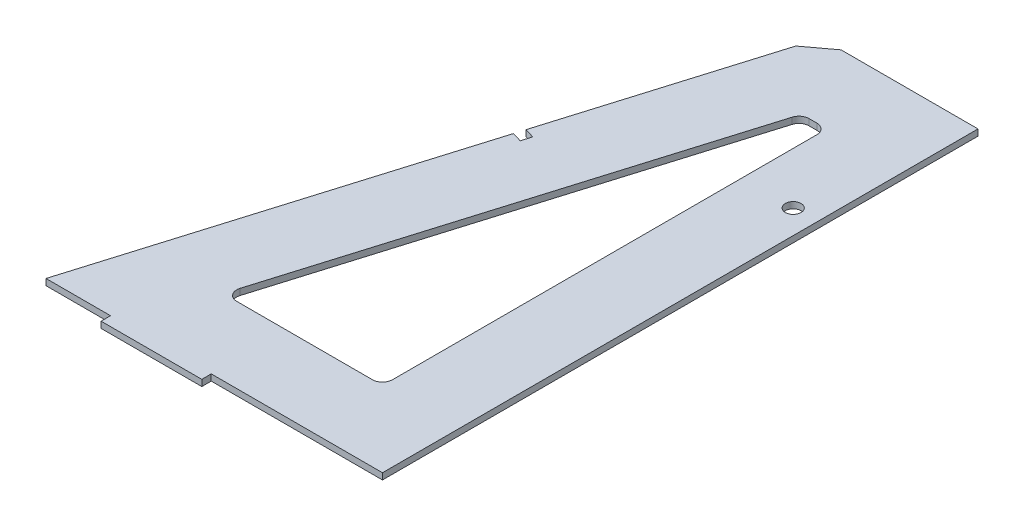
ISO-10303-21;
HEADER;
FILE_DESCRIPTION(('STEP AP214'),'2;1');
FILE_NAME('part.step','',(''),(''),'','','');
FILE_SCHEMA(('AUTOMOTIVE_DESIGN { 1 0 10303 214 1 1 1 1 }'));
ENDSEC;
DATA;
#1=APPLICATION_CONTEXT('core data for automotive mechanical design processes');
#2=APPLICATION_PROTOCOL_DEFINITION('international standard','automotive_design',2000,#1);
#3=PRODUCT_CONTEXT('',#1,'mechanical');
#4=PRODUCT('Part','Part','',(#3));
#5=PRODUCT_RELATED_PRODUCT_CATEGORY('part','',(#4));
#6=PRODUCT_DEFINITION_FORMATION('','',#4);
#7=PRODUCT_DEFINITION_CONTEXT('part definition',#1,'design');
#8=PRODUCT_DEFINITION('design','',#6,#7);
#9=PRODUCT_DEFINITION_SHAPE('','',#8);
#10=(LENGTH_UNIT() NAMED_UNIT(*) SI_UNIT(.MILLI.,.METRE.));
#11=(NAMED_UNIT(*) PLANE_ANGLE_UNIT() SI_UNIT($,.RADIAN.));
#12=(NAMED_UNIT(*) SI_UNIT($,.STERADIAN.) SOLID_ANGLE_UNIT());
#13=UNCERTAINTY_MEASURE_WITH_UNIT(LENGTH_MEASURE(1.E-05),#10,'distance_accuracy_value','');
#14=(GEOMETRIC_REPRESENTATION_CONTEXT(3) GLOBAL_UNCERTAINTY_ASSIGNED_CONTEXT((#13)) GLOBAL_UNIT_ASSIGNED_CONTEXT((#10,
#11,#12)) REPRESENTATION_CONTEXT('',''));
#15=CARTESIAN_POINT('',(0.,0.,0.));
#16=DIRECTION('',(0.,0.,1.));
#17=DIRECTION('',(1.,0.,0.));
#18=AXIS2_PLACEMENT_3D('',#15,#16,#17);
#19=CARTESIAN_POINT('',(-115.889171037202,3.175,0.));
#20=DIRECTION('',(0.95748987854251,0.,0.28846686549524));
#21=DIRECTION('',(0.28846686549524,0.,-0.95748987854251));
#22=AXIS2_PLACEMENT_3D('',#19,#20,#21);
#23=PLANE('',#22);
#24=DIRECTION('',(-0.28846686549524,0.,0.95748987854251));
#25=VECTOR('',#24,1.);
#26=CARTESIAN_POINT('',(-115.889171037202,0.,0.));
#27=LINE('',#26,#25);
#28=CARTESIAN_POINT('',(-28.3308233534316,0.,-290.626902834008));
#29=VERTEX_POINT('',#28);
#30=CARTESIAN_POINT('',(-59.8371744028218,0.,-186.049858299595));
#31=VERTEX_POINT('',#30);
#32=EDGE_CURVE('E214',#29,#31,#27,.T.);
#33=ORIENTED_EDGE('',*,*,#32,.T.);
#34=DIRECTION('',(0.,1.,0.));
#35=VECTOR('',#34,1.);
#36=CARTESIAN_POINT('',(-59.8371744028218,0.,-186.049858299595));
#37=LINE('',#36,#35);
#38=CARTESIAN_POINT('',(-59.8371744028218,3.175,-186.049858299595));
#39=VERTEX_POINT('',#38);
#40=EDGE_CURVE('E295',#31,#39,#37,.T.);
#41=ORIENTED_EDGE('',*,*,#40,.T.);
#42=DIRECTION('',(-0.28846686549524,0.,0.95748987854251));
#43=VECTOR('',#42,1.);
#44=CARTESIAN_POINT('',(-115.889171037202,3.175,0.));
#45=LINE('',#44,#43);
#46=CARTESIAN_POINT('',(-28.3308233534316,3.175,-290.626902834008));
#47=VERTEX_POINT('',#46);
#48=EDGE_CURVE('E402',#47,#39,#45,.T.);
#49=ORIENTED_EDGE('',*,*,#48,.F.);
#50=DIRECTION('',(0.,1.,0.));
#51=VECTOR('',#50,1.);
#52=CARTESIAN_POINT('',(-28.3308233534316,0.,-290.626902834008));
#53=LINE('',#52,#51);
#54=EDGE_CURVE('E341',#29,#47,#53,.T.);
#55=ORIENTED_EDGE('',*,*,#54,.F.);
#56=EDGE_LOOP('',(#33,#41,#49,#55));
#57=FACE_BOUND('',#56,.T.);
#58=ADVANCED_FACE('F41',(#57),#23,.F.);
#59=CARTESIAN_POINT('',(0.,3.175,0.));
#60=DIRECTION('',(0.,0.,-1.));
#61=DIRECTION('',(-1.,0.,0.));
#62=AXIS2_PLACEMENT_3D('',#59,#60,#61);
#63=PLANE('',#62);
#64=DIRECTION('',(0.,1.,0.));
#65=VECTOR('',#64,1.);
#66=CARTESIAN_POINT('',(-32.544585518601,3.175,0.));
#67=LINE('',#66,#65);
#68=CARTESIAN_POINT('',(-32.544585518601,0.,0.));
#69=VERTEX_POINT('',#68);
#70=CARTESIAN_POINT('',(-32.544585518601,3.175,0.));
#71=VERTEX_POINT('',#70);
#72=EDGE_CURVE('E364',#69,#71,#67,.T.);
#73=ORIENTED_EDGE('',*,*,#72,.F.);
#74=DIRECTION('',(1.,0.,0.));
#75=VECTOR('',#74,1.);
#76=CARTESIAN_POINT('',(0.,0.,0.));
#77=LINE('',#76,#75);
#78=CARTESIAN_POINT('',(53.8189678,0.,0.));
#79=VERTEX_POINT('',#78);
#80=EDGE_CURVE('E220',#69,#79,#77,.T.);
#81=ORIENTED_EDGE('',*,*,#80,.T.);
#82=DIRECTION('',(0.,-1.,0.));
#83=VECTOR('',#82,1.);
#84=CARTESIAN_POINT('',(53.8189678,3.175,0.));
#85=LINE('',#84,#83);
#86=CARTESIAN_POINT('',(53.8189678,3.175,0.));
#87=VERTEX_POINT('',#86);
#88=EDGE_CURVE('E331',#87,#79,#85,.T.);
#89=ORIENTED_EDGE('',*,*,#88,.F.);
#90=DIRECTION('',(1.,0.,0.));
#91=VECTOR('',#90,1.);
#92=CARTESIAN_POINT('',(0.,3.175,0.));
#93=LINE('',#92,#91);
#94=EDGE_CURVE('E405',#71,#87,#93,.T.);
#95=ORIENTED_EDGE('',*,*,#94,.F.);
#96=EDGE_LOOP('',(#73,#81,#89,#95));
#97=FACE_BOUND('',#96,.T.);
#98=ADVANCED_FACE('F419',(#97),#63,.F.);
#99=DIRECTION('',(0.,-1.,0.));
#100=VECTOR('',#99,1.);
#101=CARTESIAN_POINT('',(-83.344585518601,3.175,0.));
#102=LINE('',#101,#100);
#103=CARTESIAN_POINT('',(-83.3445855186009,3.175,0.));
#104=VERTEX_POINT('',#103);
#105=CARTESIAN_POINT('',(-83.344585518601,0.,0.));
#106=VERTEX_POINT('',#105);
#107=EDGE_CURVE('E370',#104,#106,#102,.T.);
#108=ORIENTED_EDGE('',*,*,#107,.F.);
#109=CARTESIAN_POINT('',(-115.889171037202,3.175,0.));
#110=VERTEX_POINT('',#109);
#111=EDGE_CURVE('E233',#110,#104,#93,.T.);
#112=ORIENTED_EDGE('',*,*,#111,.F.);
#113=DIRECTION('',(0.,-1.,0.));
#114=VECTOR('',#113,1.);
#115=CARTESIAN_POINT('',(-115.889171037202,3.175,0.));
#116=LINE('',#115,#114);
#117=CARTESIAN_POINT('',(-115.889171037202,0.,0.));
#118=VERTEX_POINT('',#117);
#119=EDGE_CURVE('E229',#110,#118,#116,.T.);
#120=ORIENTED_EDGE('',*,*,#119,.T.);
#121=EDGE_CURVE('E212',#118,#106,#77,.T.);
#122=ORIENTED_EDGE('',*,*,#121,.T.);
#123=EDGE_LOOP('',(#108,#112,#120,#122));
#124=FACE_BOUND('',#123,.T.);
#125=ADVANCED_FACE('F472',(#124),#63,.F.);
#126=CARTESIAN_POINT('',(-25.4,3.175,-300.355));
#127=DIRECTION('',(0.,0.,1.));
#128=DIRECTION('',(1.,0.,0.));
#129=AXIS2_PLACEMENT_3D('',#126,#127,#128);
#130=PLANE('',#129);
#131=DIRECTION('',(-1.,0.,0.));
#132=VECTOR('',#131,1.);
#133=CARTESIAN_POINT('',(-25.4,0.,-300.355));
#134=LINE('',#133,#132);
#135=CARTESIAN_POINT('',(53.8189678,0.,-300.355));
#136=VERTEX_POINT('',#135);
#137=CARTESIAN_POINT('',(-15.2399999999999,0.,-300.355));
#138=VERTEX_POINT('',#137);
#139=EDGE_CURVE('E215',#136,#138,#134,.T.);
#140=ORIENTED_EDGE('',*,*,#139,.T.);
#141=DIRECTION('',(0.,1.,0.));
#142=VECTOR('',#141,1.);
#143=CARTESIAN_POINT('',(-15.24,0.,-300.355));
#144=LINE('',#143,#142);
#145=CARTESIAN_POINT('',(-15.24,3.175,-300.355));
#146=VERTEX_POINT('',#145);
#147=EDGE_CURVE('E336',#138,#146,#144,.T.);
#148=ORIENTED_EDGE('',*,*,#147,.T.);
#149=DIRECTION('',(-1.,0.,0.));
#150=VECTOR('',#149,1.);
#151=CARTESIAN_POINT('',(-25.4,3.175,-300.355));
#152=LINE('',#151,#150);
#153=CARTESIAN_POINT('',(53.8189678,3.175,-300.355));
#154=VERTEX_POINT('',#153);
#155=EDGE_CURVE('E228',#154,#146,#152,.T.);
#156=ORIENTED_EDGE('',*,*,#155,.F.);
#157=DIRECTION('',(0.,1.,0.));
#158=VECTOR('',#157,1.);
#159=CARTESIAN_POINT('',(53.8189678,0.,-300.355));
#160=LINE('',#159,#158);
#161=EDGE_CURVE('E356',#136,#154,#160,.T.);
#162=ORIENTED_EDGE('',*,*,#161,.F.);
#163=EDGE_LOOP('',(#140,#148,#156,#162));
#164=FACE_BOUND('',#163,.T.);
#165=ADVANCED_FACE('F425',(#164),#130,.F.);
#166=CARTESIAN_POINT('',(-61.3025860795376,3.175,-181.185809716599));
#167=VERTEX_POINT('',#166);
#168=EDGE_CURVE('E203',#167,#110,#45,.T.);
#169=ORIENTED_EDGE('',*,*,#168,.F.);
#170=DIRECTION('',(0.,1.,0.));
#171=VECTOR('',#170,1.);
#172=CARTESIAN_POINT('',(-61.3025860795376,0.,-181.185809716599));
#173=LINE('',#172,#171);
#174=CARTESIAN_POINT('',(-61.3025860795376,0.,-181.185809716599));
#175=VERTEX_POINT('',#174);
#176=EDGE_CURVE('E189',#175,#167,#173,.T.);
#177=ORIENTED_EDGE('',*,*,#176,.F.);
#178=EDGE_CURVE('E201',#175,#118,#27,.T.);
#179=ORIENTED_EDGE('',*,*,#178,.T.);
#180=ORIENTED_EDGE('',*,*,#119,.F.);
#181=EDGE_LOOP('',(#169,#177,#179,#180));
#182=FACE_BOUND('',#181,.T.);
#183=ADVANCED_FACE('F199',(#182),#23,.F.);
#184=CARTESIAN_POINT('',(0.,3.175,0.));
#185=DIRECTION('',(0.,-1.,0.));
#186=DIRECTION('',(0.,0.,-1.));
#187=AXIS2_PLACEMENT_3D('',#184,#185,#186);
#188=PLANE('',#187);
#189=DIRECTION('',(1.,0.,0.));
#190=VECTOR('',#189,1.);
#191=CARTESIAN_POINT('',(-64.6190859162038,3.175,-38.1));
#192=LINE('',#191,#190);
#193=CARTESIAN_POINT('',(-57.7830745667374,3.175,-38.1));
#194=VERTEX_POINT('',#193);
#195=CARTESIAN_POINT('',(10.6389678,3.175,-38.1));
#196=VERTEX_POINT('',#195);
#197=EDGE_CURVE('E285',#194,#196,#192,.T.);
#198=ORIENTED_EDGE('',*,*,#197,.F.);
#199=CARTESIAN_POINT('',(-57.7830745667374,3.175,-43.18));
#200=DIRECTION('',(0.,-1.,0.));
#201=DIRECTION('',(0.,0.,-1.));
#202=AXIS2_PLACEMENT_3D('',#199,#200,#201);
#203=CIRCLE('',#202,5.08);
#204=CARTESIAN_POINT('',(-62.6471231497334,3.175,-44.6454116767158));
#205=VERTEX_POINT('',#204);
#206=EDGE_CURVE('E50',#194,#205,#203,.T.);
#207=ORIENTED_EDGE('',*,*,#206,.T.);
#208=DIRECTION('',(-0.28846686549524,0.,0.95748987854251));
#209=VECTOR('',#208,1.);
#210=CARTESIAN_POINT('',(2.91300155976297,3.175,-262.255));
#211=LINE('',#210,#209);
#212=CARTESIAN_POINT('',(1.82401985140209,3.175,-258.640411676716));
#213=VERTEX_POINT('',#212);
#214=EDGE_CURVE('E284',#213,#205,#211,.T.);
#215=ORIENTED_EDGE('',*,*,#214,.F.);
#216=CARTESIAN_POINT('',(6.68806843439804,3.175,-257.175));
#217=DIRECTION('',(0.,-1.,0.));
#218=DIRECTION('',(0.,0.,-1.));
#219=AXIS2_PLACEMENT_3D('',#216,#217,#218);
#220=CIRCLE('',#219,5.08);
#221=CARTESIAN_POINT('',(6.68806843439804,3.175,-262.255));
#222=VERTEX_POINT('',#221);
#223=EDGE_CURVE('E260',#213,#222,#220,.T.);
#224=ORIENTED_EDGE('',*,*,#223,.T.);
#225=DIRECTION('',(-1.,0.,0.));
#226=VECTOR('',#225,1.);
#227=CARTESIAN_POINT('',(15.7189678,3.175,-262.255));
#228=LINE('',#227,#226);
#229=CARTESIAN_POINT('',(10.6389678,3.175,-262.255));
#230=VERTEX_POINT('',#229);
#231=EDGE_CURVE('E312',#230,#222,#228,.T.);
#232=ORIENTED_EDGE('',*,*,#231,.F.);
#233=CARTESIAN_POINT('',(10.6389678,3.175,-257.175));
#234=DIRECTION('',(0.,-1.,0.));
#235=DIRECTION('',(0.,0.,-1.));
#236=AXIS2_PLACEMENT_3D('',#233,#234,#235);
#237=CIRCLE('',#236,5.08);
#238=CARTESIAN_POINT('',(15.7189678,3.175,-257.175));
#239=VERTEX_POINT('',#238);
#240=EDGE_CURVE('E266',#230,#239,#237,.T.);
#241=ORIENTED_EDGE('',*,*,#240,.T.);
#242=DIRECTION('',(0.,0.,-1.));
#243=VECTOR('',#242,1.);
#244=CARTESIAN_POINT('',(15.7189678,3.175,-38.1));
#245=LINE('',#244,#243);
#246=CARTESIAN_POINT('',(15.7189678,3.175,-43.18));
#247=VERTEX_POINT('',#246);
#248=EDGE_CURVE('E320',#247,#239,#245,.T.);
#249=ORIENTED_EDGE('',*,*,#248,.F.);
#250=CARTESIAN_POINT('',(10.6389678,3.175,-43.18));
#251=DIRECTION('',(0.,-1.,0.));
#252=DIRECTION('',(0.,0.,-1.));
#253=AXIS2_PLACEMENT_3D('',#250,#251,#252);
#254=CIRCLE('',#253,5.08);
#255=EDGE_CURVE('E272',#247,#196,#254,.T.);
#256=ORIENTED_EDGE('',*,*,#255,.T.);
#257=EDGE_LOOP('',(#198,#207,#215,#224,#232,#241,#249,#256));
#258=FACE_BOUND('',#257,.T.);
#259=CARTESIAN_POINT('',(41.7539678,3.175,-219.202));
#260=DIRECTION('',(0.,1.,0.));
#261=DIRECTION('',(0.,0.,1.));
#262=AXIS2_PLACEMENT_3D('',#259,#260,#261);
#263=CIRCLE('',#262,3.96874999999999);
#264=CARTESIAN_POINT('',(41.7539678,3.175,-215.23325));
#265=VERTEX_POINT('',#264);
#266=EDGE_CURVE('E332',#265,#265,#263,.T.);
#267=ORIENTED_EDGE('',*,*,#266,.F.);
#268=EDGE_LOOP('',(#267));
#269=FACE_BOUND('',#268,.T.);
#270=ORIENTED_EDGE('',*,*,#48,.T.);
#271=DIRECTION('',(-0.957489878542508,0.,-0.288466865495246));
#272=VECTOR('',#271,1.);
#273=CARTESIAN_POINT('',(-59.8371744028218,3.175,-186.049858299595));
#274=LINE('',#273,#272);
#275=CARTESIAN_POINT('',(-54.9731258198258,3.175,-184.584446622879));
#276=VERTEX_POINT('',#275);
#277=EDGE_CURVE('E195',#276,#39,#274,.T.);
#278=ORIENTED_EDGE('',*,*,#277,.F.);
#279=DIRECTION('',(0.288466865495241,0.,-0.95748987854251));
#280=VECTOR('',#279,1.);
#281=CARTESIAN_POINT('',(-54.9731258198258,3.175,-184.584446622879));
#282=LINE('',#281,#280);
#283=CARTESIAN_POINT('',(-56.4385374965417,3.175,-179.720398039883));
#284=VERTEX_POINT('',#283);
#285=EDGE_CURVE('E448',#284,#276,#282,.T.);
#286=ORIENTED_EDGE('',*,*,#285,.F.);
#287=DIRECTION('',(0.957489878542512,0.,0.288466865495235));
#288=VECTOR('',#287,1.);
#289=CARTESIAN_POINT('',(-56.4385374965417,3.175,-179.720398039883));
#290=LINE('',#289,#288);
#291=EDGE_CURVE('E449',#167,#284,#290,.T.);
#292=ORIENTED_EDGE('',*,*,#291,.F.);
#293=ORIENTED_EDGE('',*,*,#168,.T.);
#294=ORIENTED_EDGE('',*,*,#111,.T.);
#295=DIRECTION('',(0.,0.,-1.));
#296=VECTOR('',#295,1.);
#297=CARTESIAN_POINT('',(-83.344585518601,3.175,4.7625));
#298=LINE('',#297,#296);
#299=CARTESIAN_POINT('',(-83.344585518601,3.175,4.7625));
#300=VERTEX_POINT('',#299);
#301=EDGE_CURVE('E392',#300,#104,#298,.T.);
#302=ORIENTED_EDGE('',*,*,#301,.F.);
#303=DIRECTION('',(-1.,0.,0.));
#304=VECTOR('',#303,1.);
#305=CARTESIAN_POINT('',(-83.344585518601,3.175,4.7625));
#306=LINE('',#305,#304);
#307=CARTESIAN_POINT('',(-32.544585518601,3.175,4.7625));
#308=VERTEX_POINT('',#307);
#309=EDGE_CURVE('E369',#308,#300,#306,.T.);
#310=ORIENTED_EDGE('',*,*,#309,.F.);
#311=DIRECTION('',(0.,0.,-1.));
#312=VECTOR('',#311,1.);
#313=CARTESIAN_POINT('',(-32.544585518601,3.175,4.7625));
#314=LINE('',#313,#312);
#315=EDGE_CURVE('E222',#308,#71,#314,.T.);
#316=ORIENTED_EDGE('',*,*,#315,.T.);
#317=ORIENTED_EDGE('',*,*,#94,.T.);
#318=DIRECTION('',(0.,0.,1.));
#319=VECTOR('',#318,1.);
#320=CARTESIAN_POINT('',(53.8189678,3.175,-300.355));
#321=LINE('',#320,#319);
#322=EDGE_CURVE('E360',#154,#87,#321,.T.);
#323=ORIENTED_EDGE('',*,*,#322,.F.);
#324=ORIENTED_EDGE('',*,*,#155,.T.);
#325=DIRECTION('',(0.802641534402264,0.,-0.596461706442567));
#326=VECTOR('',#325,1.);
#327=CARTESIAN_POINT('',(-28.3308233534316,3.175,-290.626902834008));
#328=LINE('',#327,#326);
#329=EDGE_CURVE('E316',#47,#146,#328,.T.);
#330=ORIENTED_EDGE('',*,*,#329,.F.);
#331=EDGE_LOOP('',(#270,#278,#286,#292,#293,#294,#302,#310,#316,#317,#323,#324,#330));
#332=FACE_BOUND('',#331,.T.);
#333=ADVANCED_FACE('F282',(#258,#269,#332),#188,.F.);
#334=CARTESIAN_POINT('',(0.,0.,0.));
#335=DIRECTION('',(0.,-1.,0.));
#336=DIRECTION('',(0.,0.,-1.));
#337=AXIS2_PLACEMENT_3D('',#334,#335,#336);
#338=PLANE('',#337);
#339=DIRECTION('',(-0.957489878542508,0.,-0.288466865495246));
#340=VECTOR('',#339,1.);
#341=CARTESIAN_POINT('',(-59.8371744028218,0.,-186.049858299595));
#342=LINE('',#341,#340);
#343=CARTESIAN_POINT('',(-54.9731258198258,0.,-184.584446622879));
#344=VERTEX_POINT('',#343);
#345=EDGE_CURVE('E205',#344,#31,#342,.T.);
#346=ORIENTED_EDGE('',*,*,#345,.T.);
#347=ORIENTED_EDGE('',*,*,#32,.F.);
#348=DIRECTION('',(0.802641534402264,0.,-0.596461706442567));
#349=VECTOR('',#348,1.);
#350=CARTESIAN_POINT('',(-28.3308233534316,0.,-290.626902834008));
#351=LINE('',#350,#349);
#352=EDGE_CURVE('E337',#29,#138,#351,.T.);
#353=ORIENTED_EDGE('',*,*,#352,.T.);
#354=ORIENTED_EDGE('',*,*,#139,.F.);
#355=DIRECTION('',(0.,0.,-1.));
#356=VECTOR('',#355,1.);
#357=CARTESIAN_POINT('',(53.8189678,0.,0.));
#358=LINE('',#357,#356);
#359=EDGE_CURVE('E352',#79,#136,#358,.T.);
#360=ORIENTED_EDGE('',*,*,#359,.F.);
#361=ORIENTED_EDGE('',*,*,#80,.F.);
#362=DIRECTION('',(0.,0.,-1.));
#363=VECTOR('',#362,1.);
#364=CARTESIAN_POINT('',(-32.544585518601,0.,4.7625));
#365=LINE('',#364,#363);
#366=CARTESIAN_POINT('',(-32.544585518601,0.,4.7625));
#367=VERTEX_POINT('',#366);
#368=EDGE_CURVE('E379',#367,#69,#365,.T.);
#369=ORIENTED_EDGE('',*,*,#368,.F.);
#370=DIRECTION('',(1.,0.,0.));
#371=VECTOR('',#370,1.);
#372=CARTESIAN_POINT('',(-83.344585518601,0.,4.7625));
#373=LINE('',#372,#371);
#374=CARTESIAN_POINT('',(-83.344585518601,0.,4.7625));
#375=VERTEX_POINT('',#374);
#376=EDGE_CURVE('E376',#375,#367,#373,.T.);
#377=ORIENTED_EDGE('',*,*,#376,.F.);
#378=DIRECTION('',(0.,0.,-1.));
#379=VECTOR('',#378,1.);
#380=CARTESIAN_POINT('',(-83.344585518601,0.,4.7625));
#381=LINE('',#380,#379);
#382=EDGE_CURVE('E389',#375,#106,#381,.T.);
#383=ORIENTED_EDGE('',*,*,#382,.T.);
#384=ORIENTED_EDGE('',*,*,#121,.F.);
#385=ORIENTED_EDGE('',*,*,#178,.F.);
#386=DIRECTION('',(0.957489878542512,0.,0.288466865495235));
#387=VECTOR('',#386,1.);
#388=CARTESIAN_POINT('',(-56.4385374965417,0.,-179.720398039883));
#389=LINE('',#388,#387);
#390=CARTESIAN_POINT('',(-56.4385374965417,0.,-179.720398039883));
#391=VERTEX_POINT('',#390);
#392=EDGE_CURVE('E185',#175,#391,#389,.T.);
#393=ORIENTED_EDGE('',*,*,#392,.T.);
#394=DIRECTION('',(0.288466865495241,0.,-0.95748987854251));
#395=VECTOR('',#394,1.);
#396=CARTESIAN_POINT('',(-54.9731258198258,0.,-184.584446622879));
#397=LINE('',#396,#395);
#398=EDGE_CURVE('E57',#391,#344,#397,.T.);
#399=ORIENTED_EDGE('',*,*,#398,.T.);
#400=EDGE_LOOP('',(#346,#347,#353,#354,#360,#361,#369,#377,#383,#384,#385,#393,#399));
#401=FACE_BOUND('',#400,.T.);
#402=DIRECTION('',(-1.,0.,0.));
#403=VECTOR('',#402,1.);
#404=CARTESIAN_POINT('',(15.7189678,0.,-262.255));
#405=LINE('',#404,#403);
#406=CARTESIAN_POINT('',(10.6389678,0.,-262.255));
#407=VERTEX_POINT('',#406);
#408=CARTESIAN_POINT('',(6.68806843439804,0.,-262.255));
#409=VERTEX_POINT('',#408);
#410=EDGE_CURVE('E310',#407,#409,#405,.T.);
#411=ORIENTED_EDGE('',*,*,#410,.T.);
#412=CARTESIAN_POINT('',(6.68806843439804,0.,-257.175));
#413=DIRECTION('',(0.,-1.,0.));
#414=DIRECTION('',(0.,0.,-1.));
#415=AXIS2_PLACEMENT_3D('',#412,#413,#414);
#416=CIRCLE('',#415,5.08);
#417=CARTESIAN_POINT('',(1.82401985140209,0.,-258.640411676716));
#418=VERTEX_POINT('',#417);
#419=EDGE_CURVE('E263',#409,#418,#416,.F.);
#420=ORIENTED_EDGE('',*,*,#419,.T.);
#421=DIRECTION('',(-0.28846686549524,0.,0.95748987854251));
#422=VECTOR('',#421,1.);
#423=CARTESIAN_POINT('',(2.91300155976297,0.,-262.255));
#424=LINE('',#423,#422);
#425=CARTESIAN_POINT('',(-62.6471231497334,0.,-44.6454116767158));
#426=VERTEX_POINT('',#425);
#427=EDGE_CURVE('E302',#418,#426,#424,.T.);
#428=ORIENTED_EDGE('',*,*,#427,.T.);
#429=CARTESIAN_POINT('',(-57.7830745667374,0.,-43.18));
#430=DIRECTION('',(0.,-1.,0.));
#431=DIRECTION('',(0.,0.,-1.));
#432=AXIS2_PLACEMENT_3D('',#429,#430,#431);
#433=CIRCLE('',#432,5.08);
#434=CARTESIAN_POINT('',(-57.7830745667374,0.,-38.1));
#435=VERTEX_POINT('',#434);
#436=EDGE_CURVE('E11',#426,#435,#433,.F.);
#437=ORIENTED_EDGE('',*,*,#436,.T.);
#438=DIRECTION('',(1.,0.,0.));
#439=VECTOR('',#438,1.);
#440=CARTESIAN_POINT('',(-64.6190859162038,0.,-38.1));
#441=LINE('',#440,#439);
#442=CARTESIAN_POINT('',(10.6389678,0.,-38.1));
#443=VERTEX_POINT('',#442);
#444=EDGE_CURVE('E300',#435,#443,#441,.T.);
#445=ORIENTED_EDGE('',*,*,#444,.T.);
#446=CARTESIAN_POINT('',(10.6389678,0.,-43.18));
#447=DIRECTION('',(0.,-1.,0.));
#448=DIRECTION('',(0.,0.,-1.));
#449=AXIS2_PLACEMENT_3D('',#446,#447,#448);
#450=CIRCLE('',#449,5.08);
#451=CARTESIAN_POINT('',(15.7189678,0.,-43.18));
#452=VERTEX_POINT('',#451);
#453=EDGE_CURVE('E275',#443,#452,#450,.F.);
#454=ORIENTED_EDGE('',*,*,#453,.T.);
#455=DIRECTION('',(0.,0.,-1.));
#456=VECTOR('',#455,1.);
#457=CARTESIAN_POINT('',(15.7189678,0.,-38.1));
#458=LINE('',#457,#456);
#459=CARTESIAN_POINT('',(15.7189678,0.,-257.175));
#460=VERTEX_POINT('',#459);
#461=EDGE_CURVE('E305',#452,#460,#458,.T.);
#462=ORIENTED_EDGE('',*,*,#461,.T.);
#463=CARTESIAN_POINT('',(10.6389678,0.,-257.175));
#464=DIRECTION('',(0.,-1.,0.));
#465=DIRECTION('',(0.,0.,-1.));
#466=AXIS2_PLACEMENT_3D('',#463,#464,#465);
#467=CIRCLE('',#466,5.08);
#468=EDGE_CURVE('E269',#460,#407,#467,.F.);
#469=ORIENTED_EDGE('',*,*,#468,.T.);
#470=EDGE_LOOP('',(#411,#420,#428,#437,#445,#454,#462,#469));
#471=FACE_BOUND('',#470,.T.);
#472=CARTESIAN_POINT('',(41.7539678,0.,-219.202));
#473=DIRECTION('',(0.,1.,0.));
#474=DIRECTION('',(0.,0.,1.));
#475=AXIS2_PLACEMENT_3D('',#472,#473,#474);
#476=CIRCLE('',#475,3.96874999999999);
#477=CARTESIAN_POINT('',(41.7539678,0.,-215.23325));
#478=VERTEX_POINT('',#477);
#479=EDGE_CURVE('E327',#478,#478,#476,.T.);
#480=ORIENTED_EDGE('',*,*,#479,.T.);
#481=EDGE_LOOP('',(#480));
#482=FACE_BOUND('',#481,.T.);
#483=ADVANCED_FACE('F209',(#401,#471,#482),#338,.T.);
#484=CARTESIAN_POINT('',(-32.544585518601,3.175,4.7625));
#485=DIRECTION('',(-1.,0.,0.));
#486=DIRECTION('',(0.,-1.,0.));
#487=AXIS2_PLACEMENT_3D('',#484,#485,#486);
#488=PLANE('',#487);
#489=ORIENTED_EDGE('',*,*,#72,.T.);
#490=ORIENTED_EDGE('',*,*,#315,.F.);
#491=DIRECTION('',(0.,1.,0.));
#492=VECTOR('',#491,1.);
#493=CARTESIAN_POINT('',(-32.544585518601,3.175,4.7625));
#494=LINE('',#493,#492);
#495=EDGE_CURVE('E365',#367,#308,#494,.T.);
#496=ORIENTED_EDGE('',*,*,#495,.F.);
#497=ORIENTED_EDGE('',*,*,#368,.T.);
#498=EDGE_LOOP('',(#489,#490,#496,#497));
#499=FACE_BOUND('',#498,.T.);
#500=ADVANCED_FACE('F539',(#499),#488,.F.);
#501=CARTESIAN_POINT('',(-83.344585518601,3.175,4.7625));
#502=DIRECTION('',(1.,0.,0.));
#503=DIRECTION('',(0.,0.,-1.));
#504=AXIS2_PLACEMENT_3D('',#501,#502,#503);
#505=PLANE('',#504);
#506=ORIENTED_EDGE('',*,*,#107,.T.);
#507=ORIENTED_EDGE('',*,*,#382,.F.);
#508=DIRECTION('',(0.,-1.,0.));
#509=VECTOR('',#508,1.);
#510=CARTESIAN_POINT('',(-83.344585518601,3.175,4.7625));
#511=LINE('',#510,#509);
#512=EDGE_CURVE('E373',#300,#375,#511,.T.);
#513=ORIENTED_EDGE('',*,*,#512,.F.);
#514=ORIENTED_EDGE('',*,*,#301,.T.);
#515=EDGE_LOOP('',(#506,#507,#513,#514));
#516=FACE_BOUND('',#515,.T.);
#517=ADVANCED_FACE('F535',(#516),#505,.F.);
#518=CARTESIAN_POINT('',(0.,0.,4.7625));
#519=DIRECTION('',(0.,0.,1.));
#520=DIRECTION('',(1.,0.,0.));
#521=AXIS2_PLACEMENT_3D('',#518,#519,#520);
#522=PLANE('',#521);
#523=ORIENTED_EDGE('',*,*,#495,.T.);
#524=ORIENTED_EDGE('',*,*,#309,.T.);
#525=ORIENTED_EDGE('',*,*,#512,.T.);
#526=ORIENTED_EDGE('',*,*,#376,.T.);
#527=EDGE_LOOP('',(#523,#524,#525,#526));
#528=FACE_BOUND('',#527,.T.);
#529=ADVANCED_FACE('F532',(#528),#522,.T.);
#530=CARTESIAN_POINT('',(53.8189678,0.,0.));
#531=DIRECTION('',(1.,0.,0.));
#532=DIRECTION('',(0.,0.,-1.));
#533=AXIS2_PLACEMENT_3D('',#530,#531,#532);
#534=PLANE('',#533);
#535=ORIENTED_EDGE('',*,*,#88,.T.);
#536=ORIENTED_EDGE('',*,*,#359,.T.);
#537=ORIENTED_EDGE('',*,*,#161,.T.);
#538=ORIENTED_EDGE('',*,*,#322,.T.);
#539=EDGE_LOOP('',(#535,#536,#537,#538));
#540=FACE_BOUND('',#539,.T.);
#541=ADVANCED_FACE('F417',(#540),#534,.T.);
#542=CARTESIAN_POINT('',(-28.3308233534316,0.,-290.626902834008));
#543=DIRECTION('',(0.596461706442567,0.,0.802641534402264));
#544=DIRECTION('',(0.802641534402265,0.,-0.596461706442567));
#545=AXIS2_PLACEMENT_3D('',#542,#543,#544);
#546=PLANE('',#545);
#547=ORIENTED_EDGE('',*,*,#329,.T.);
#548=ORIENTED_EDGE('',*,*,#147,.F.);
#549=ORIENTED_EDGE('',*,*,#352,.F.);
#550=ORIENTED_EDGE('',*,*,#54,.T.);
#551=EDGE_LOOP('',(#547,#548,#549,#550));
#552=FACE_BOUND('',#551,.T.);
#553=ADVANCED_FACE('F526',(#552),#546,.F.);
#554=CARTESIAN_POINT('',(41.7539678,0.,-219.202));
#555=DIRECTION('',(0.,1.,0.));
#556=DIRECTION('',(0.,0.,1.));
#557=AXIS2_PLACEMENT_3D('',#554,#555,#556);
#558=CYLINDRICAL_SURFACE('',#557,3.96874999999999);
#559=ORIENTED_EDGE('',*,*,#479,.F.);
#560=EDGE_LOOP('',(#559));
#561=FACE_BOUND('',#560,.T.);
#562=ORIENTED_EDGE('',*,*,#266,.T.);
#563=EDGE_LOOP('',(#562));
#564=FACE_BOUND('',#563,.T.);
#565=ADVANCED_FACE('F518',(#561,#564),#558,.F.);
#566=CARTESIAN_POINT('',(2.91300155976297,0.,-262.255));
#567=DIRECTION('',(-0.95748987854251,0.,-0.28846686549524));
#568=DIRECTION('',(-0.28846686549524,0.,0.95748987854251));
#569=AXIS2_PLACEMENT_3D('',#566,#567,#568);
#570=PLANE('',#569);
#571=ORIENTED_EDGE('',*,*,#427,.F.);
#572=DIRECTION('',(0.,1.,0.));
#573=VECTOR('',#572,1.);
#574=CARTESIAN_POINT('',(1.82401985140209,3.175,-258.640411676716));
#575=LINE('',#574,#573);
#576=EDGE_CURVE('E236',#418,#213,#575,.T.);
#577=ORIENTED_EDGE('',*,*,#576,.T.);
#578=ORIENTED_EDGE('',*,*,#214,.T.);
#579=DIRECTION('',(0.,1.,0.));
#580=VECTOR('',#579,1.);
#581=CARTESIAN_POINT('',(-62.6471231497334,0.,-44.6454116767158));
#582=LINE('',#581,#580);
#583=EDGE_CURVE('E232',#205,#426,#582,.F.);
#584=ORIENTED_EDGE('',*,*,#583,.T.);
#585=EDGE_LOOP('',(#571,#577,#578,#584));
#586=FACE_BOUND('',#585,.T.);
#587=ADVANCED_FACE('F291',(#586),#570,.F.);
#588=CARTESIAN_POINT('',(15.7189678,0.,-262.255));
#589=DIRECTION('',(0.,0.,-1.));
#590=DIRECTION('',(-1.,0.,0.));
#591=AXIS2_PLACEMENT_3D('',#588,#589,#590);
#592=PLANE('',#591);
#593=ORIENTED_EDGE('',*,*,#231,.T.);
#594=DIRECTION('',(0.,1.,0.));
#595=VECTOR('',#594,1.);
#596=CARTESIAN_POINT('',(6.68806843439804,0.,-262.255));
#597=LINE('',#596,#595);
#598=EDGE_CURVE('E244',#222,#409,#597,.F.);
#599=ORIENTED_EDGE('',*,*,#598,.T.);
#600=ORIENTED_EDGE('',*,*,#410,.F.);
#601=DIRECTION('',(0.,1.,0.));
#602=VECTOR('',#601,1.);
#603=CARTESIAN_POINT('',(10.6389678,3.175,-262.255));
#604=LINE('',#603,#602);
#605=EDGE_CURVE('E240',#407,#230,#604,.T.);
#606=ORIENTED_EDGE('',*,*,#605,.T.);
#607=EDGE_LOOP('',(#593,#599,#600,#606));
#608=FACE_BOUND('',#607,.T.);
#609=ADVANCED_FACE('F508',(#608),#592,.F.);
#610=CARTESIAN_POINT('',(15.7189678,0.,-38.1));
#611=DIRECTION('',(1.,0.,0.));
#612=DIRECTION('',(0.,0.,-1.));
#613=AXIS2_PLACEMENT_3D('',#610,#611,#612);
#614=PLANE('',#613);
#615=ORIENTED_EDGE('',*,*,#248,.T.);
#616=DIRECTION('',(0.,1.,0.));
#617=VECTOR('',#616,1.);
#618=CARTESIAN_POINT('',(15.7189678,0.,-257.175));
#619=LINE('',#618,#617);
#620=EDGE_CURVE('E251',#239,#460,#619,.F.);
#621=ORIENTED_EDGE('',*,*,#620,.T.);
#622=ORIENTED_EDGE('',*,*,#461,.F.);
#623=DIRECTION('',(0.,1.,0.));
#624=VECTOR('',#623,1.);
#625=CARTESIAN_POINT('',(15.7189678,3.175,-43.18));
#626=LINE('',#625,#624);
#627=EDGE_CURVE('E247',#452,#247,#626,.T.);
#628=ORIENTED_EDGE('',*,*,#627,.T.);
#629=EDGE_LOOP('',(#615,#621,#622,#628));
#630=FACE_BOUND('',#629,.T.);
#631=ADVANCED_FACE('F501',(#630),#614,.F.);
#632=CARTESIAN_POINT('',(-64.6190859162038,0.,-38.1));
#633=DIRECTION('',(0.,0.,1.));
#634=DIRECTION('',(1.,0.,0.));
#635=AXIS2_PLACEMENT_3D('',#632,#633,#634);
#636=PLANE('',#635);
#637=ORIENTED_EDGE('',*,*,#197,.T.);
#638=DIRECTION('',(0.,1.,0.));
#639=VECTOR('',#638,1.);
#640=CARTESIAN_POINT('',(10.6389678,0.,-38.1));
#641=LINE('',#640,#639);
#642=EDGE_CURVE('E65',#196,#443,#641,.F.);
#643=ORIENTED_EDGE('',*,*,#642,.T.);
#644=ORIENTED_EDGE('',*,*,#444,.F.);
#645=DIRECTION('',(0.,1.,0.));
#646=VECTOR('',#645,1.);
#647=CARTESIAN_POINT('',(-57.7830745667374,3.175,-38.1));
#648=LINE('',#647,#646);
#649=EDGE_CURVE('E254',#435,#194,#648,.T.);
#650=ORIENTED_EDGE('',*,*,#649,.T.);
#651=EDGE_LOOP('',(#637,#643,#644,#650));
#652=FACE_BOUND('',#651,.T.);
#653=ADVANCED_FACE('F303',(#652),#636,.F.);
#654=CARTESIAN_POINT('',(6.68806843439804,0.,-257.175));
#655=DIRECTION('',(0.,-1.,0.));
#656=DIRECTION('',(0.,0.,-1.));
#657=AXIS2_PLACEMENT_3D('',#654,#655,#656);
#658=CYLINDRICAL_SURFACE('',#657,5.08);
#659=ORIENTED_EDGE('',*,*,#419,.F.);
#660=ORIENTED_EDGE('',*,*,#598,.F.);
#661=ORIENTED_EDGE('',*,*,#223,.F.);
#662=ORIENTED_EDGE('',*,*,#576,.F.);
#663=EDGE_LOOP('',(#659,#660,#661,#662));
#664=FACE_BOUND('',#663,.T.);
#665=ADVANCED_FACE('F486',(#664),#658,.F.);
#666=CARTESIAN_POINT('',(10.6389678,0.,-257.175));
#667=DIRECTION('',(0.,-1.,0.));
#668=DIRECTION('',(0.,0.,-1.));
#669=AXIS2_PLACEMENT_3D('',#666,#667,#668);
#670=CYLINDRICAL_SURFACE('',#669,5.08);
#671=ORIENTED_EDGE('',*,*,#468,.F.);
#672=ORIENTED_EDGE('',*,*,#620,.F.);
#673=ORIENTED_EDGE('',*,*,#240,.F.);
#674=ORIENTED_EDGE('',*,*,#605,.F.);
#675=EDGE_LOOP('',(#671,#672,#673,#674));
#676=FACE_BOUND('',#675,.T.);
#677=ADVANCED_FACE('F489',(#676),#670,.F.);
#678=CARTESIAN_POINT('',(10.6389678,0.,-43.18));
#679=DIRECTION('',(0.,-1.,0.));
#680=DIRECTION('',(0.,0.,-1.));
#681=AXIS2_PLACEMENT_3D('',#678,#679,#680);
#682=CYLINDRICAL_SURFACE('',#681,5.08);
#683=ORIENTED_EDGE('',*,*,#453,.F.);
#684=ORIENTED_EDGE('',*,*,#642,.F.);
#685=ORIENTED_EDGE('',*,*,#255,.F.);
#686=ORIENTED_EDGE('',*,*,#627,.F.);
#687=EDGE_LOOP('',(#683,#684,#685,#686));
#688=FACE_BOUND('',#687,.T.);
#689=ADVANCED_FACE('F466',(#688),#682,.F.);
#690=CARTESIAN_POINT('',(-57.7830745667374,0.,-43.18));
#691=DIRECTION('',(0.,-1.,0.));
#692=DIRECTION('',(0.,0.,-1.));
#693=AXIS2_PLACEMENT_3D('',#690,#691,#692);
#694=CYLINDRICAL_SURFACE('',#693,5.08);
#695=ORIENTED_EDGE('',*,*,#436,.F.);
#696=ORIENTED_EDGE('',*,*,#583,.F.);
#697=ORIENTED_EDGE('',*,*,#206,.F.);
#698=ORIENTED_EDGE('',*,*,#649,.F.);
#699=EDGE_LOOP('',(#695,#696,#697,#698));
#700=FACE_BOUND('',#699,.T.);
#701=ADVANCED_FACE('F43',(#700),#694,.F.);
#702=CARTESIAN_POINT('',(-59.8371744028218,0.,-186.049858299595));
#703=DIRECTION('',(0.288466865495246,0.,-0.957489878542508));
#704=DIRECTION('',(-0.957489878542508,0.,-0.288466865495246));
#705=AXIS2_PLACEMENT_3D('',#702,#703,#704);
#706=PLANE('',#705);
#707=ORIENTED_EDGE('',*,*,#277,.T.);
#708=ORIENTED_EDGE('',*,*,#40,.F.);
#709=ORIENTED_EDGE('',*,*,#345,.F.);
#710=DIRECTION('',(0.,1.,0.));
#711=VECTOR('',#710,1.);
#712=CARTESIAN_POINT('',(-54.9731258198258,0.,-184.584446622879));
#713=LINE('',#712,#711);
#714=EDGE_CURVE('E437',#344,#276,#713,.T.);
#715=ORIENTED_EDGE('',*,*,#714,.T.);
#716=EDGE_LOOP('',(#707,#708,#709,#715));
#717=FACE_BOUND('',#716,.T.);
#718=ADVANCED_FACE('F458',(#717),#706,.F.);
#719=CARTESIAN_POINT('',(-54.9731258198258,0.,-184.584446622879));
#720=DIRECTION('',(0.95748987854251,0.,0.288466865495241));
#721=DIRECTION('',(0.288466865495241,0.,-0.95748987854251));
#722=AXIS2_PLACEMENT_3D('',#719,#720,#721);
#723=PLANE('',#722);
#724=ORIENTED_EDGE('',*,*,#285,.T.);
#725=ORIENTED_EDGE('',*,*,#714,.F.);
#726=ORIENTED_EDGE('',*,*,#398,.F.);
#727=DIRECTION('',(0.,1.,0.));
#728=VECTOR('',#727,1.);
#729=CARTESIAN_POINT('',(-56.4385374965417,0.,-179.720398039883));
#730=LINE('',#729,#728);
#731=EDGE_CURVE('E191',#391,#284,#730,.T.);
#732=ORIENTED_EDGE('',*,*,#731,.T.);
#733=EDGE_LOOP('',(#724,#725,#726,#732));
#734=FACE_BOUND('',#733,.T.);
#735=ADVANCED_FACE('F446',(#734),#723,.F.);
#736=CARTESIAN_POINT('',(-56.4385374965417,0.,-179.720398039883));
#737=DIRECTION('',(-0.288466865495235,0.,0.957489878542512));
#738=DIRECTION('',(0.957489878542512,0.,0.288466865495235));
#739=AXIS2_PLACEMENT_3D('',#736,#737,#738);
#740=PLANE('',#739);
#741=ORIENTED_EDGE('',*,*,#291,.T.);
#742=ORIENTED_EDGE('',*,*,#731,.F.);
#743=ORIENTED_EDGE('',*,*,#392,.F.);
#744=ORIENTED_EDGE('',*,*,#176,.T.);
#745=EDGE_LOOP('',(#741,#742,#743,#744));
#746=FACE_BOUND('',#745,.T.);
#747=ADVANCED_FACE('F188',(#746),#740,.F.);
#748=CLOSED_SHELL('',(#58,#98,#125,#165,#183,#333,#483,#500,#517,#529,#541,#553,#565,#587,#609,
#631,#653,#665,#677,#689,#701,#718,#735,#747));
#749=MANIFOLD_SOLID_BREP('B2',#748);
#750=ADVANCED_BREP_SHAPE_REPRESENTATION('',(#18,#749),#14);
#751=SHAPE_DEFINITION_REPRESENTATION(#9,#750);
ENDSEC;
END-ISO-10303-21;
